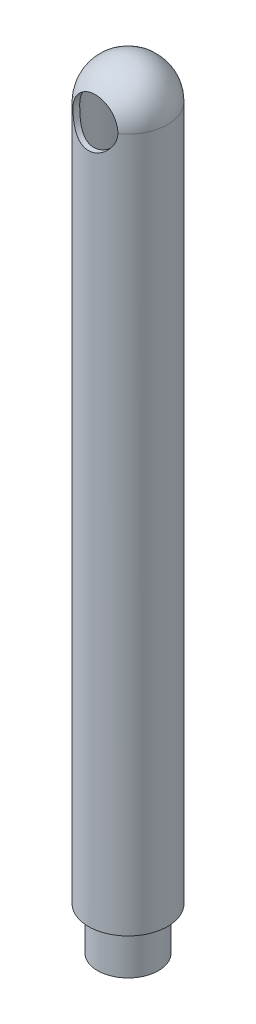
ISO-10303-21;
HEADER;
FILE_DESCRIPTION(('STEP AP214'),'2;1');
FILE_NAME('part.step','',(''),(''),'','','');
FILE_SCHEMA(('AUTOMOTIVE_DESIGN { 1 0 10303 214 1 1 1 1 }'));
ENDSEC;
DATA;
#1=APPLICATION_CONTEXT('core data for automotive mechanical design processes');
#2=APPLICATION_PROTOCOL_DEFINITION('international standard','automotive_design',2000,#1);
#3=PRODUCT_CONTEXT('',#1,'mechanical');
#4=PRODUCT('Part','Part','',(#3));
#5=PRODUCT_RELATED_PRODUCT_CATEGORY('part','',(#4));
#6=PRODUCT_DEFINITION_FORMATION('','',#4);
#7=PRODUCT_DEFINITION_CONTEXT('part definition',#1,'design');
#8=PRODUCT_DEFINITION('design','',#6,#7);
#9=PRODUCT_DEFINITION_SHAPE('','',#8);
#10=(LENGTH_UNIT() NAMED_UNIT(*) SI_UNIT(.MILLI.,.METRE.));
#11=(NAMED_UNIT(*) PLANE_ANGLE_UNIT() SI_UNIT($,.RADIAN.));
#12=(NAMED_UNIT(*) SI_UNIT($,.STERADIAN.) SOLID_ANGLE_UNIT());
#13=UNCERTAINTY_MEASURE_WITH_UNIT(LENGTH_MEASURE(1.E-05),#10,'distance_accuracy_value','');
#14=(GEOMETRIC_REPRESENTATION_CONTEXT(3) GLOBAL_UNCERTAINTY_ASSIGNED_CONTEXT((#13)) GLOBAL_UNIT_ASSIGNED_CONTEXT((#10,
#11,#12)) REPRESENTATION_CONTEXT('',''));
#15=CARTESIAN_POINT('',(0.,0.,0.));
#16=DIRECTION('',(0.,0.,1.));
#17=DIRECTION('',(1.,0.,0.));
#18=AXIS2_PLACEMENT_3D('',#15,#16,#17);
#19=CARTESIAN_POINT('',(0.,0.,0.));
#20=DIRECTION('',(0.,-1.,0.));
#21=DIRECTION('',(0.,0.,-1.));
#22=AXIS2_PLACEMENT_3D('',#19,#20,#21);
#23=CYLINDRICAL_SURFACE('',#22,37.);
#24=CARTESIAN_POINT('',(21.,689.,-30.4630924234556));
#25=CARTESIAN_POINT('',(21.0000073262817,688.731189787036,-30.4630792801586));
#26=CARTESIAN_POINT('',(20.9948387992314,688.462385228528,-30.4666501375205));
#27=CARTESIAN_POINT('',(20.9742055145974,687.925374282696,-30.4808626862339));
#28=CARTESIAN_POINT('',(20.9587413689901,687.657167860769,-30.4915039573165));
#29=CARTESIAN_POINT('',(20.9175892458381,687.122128137417,-30.5197485645538));
#30=CARTESIAN_POINT('',(20.891909689798,686.855293887867,-30.5373461658891));
#31=CARTESIAN_POINT('',(20.8304403165183,686.323346350503,-30.5793087651143));
#32=CARTESIAN_POINT('',(20.7946504035362,686.058233079011,-30.6036738270903));
#33=CARTESIAN_POINT('',(20.6728984187858,685.270076191436,-30.6861697671083));
#34=CARTESIAN_POINT('',(20.57224222865,684.750206175432,-30.753919548947));
#35=CARTESIAN_POINT('',(20.3330008256143,683.722932287711,-30.9126118163972));
#36=CARTESIAN_POINT('',(20.194409237282,683.215530527046,-31.00355820026));
#37=CARTESIAN_POINT('',(19.8814897424874,682.217754555845,-31.2051415253092));
#38=CARTESIAN_POINT('',(19.7072764882901,681.727331476066,-31.3157151471102));
#39=CARTESIAN_POINT('',(19.3246080672965,680.764219599621,-31.5532914305636));
#40=CARTESIAN_POINT('',(19.1161537036553,680.291530387311,-31.6802937068529));
#41=CARTESIAN_POINT('',(18.6662684755912,679.364844691443,-31.9474406108234));
#42=CARTESIAN_POINT('',(18.4247763649775,678.910885012706,-32.0876094921856));
#43=CARTESIAN_POINT('',(17.9106649403664,678.024079854279,-32.3773864757737));
#44=CARTESIAN_POINT('',(17.6380423976134,677.591236571377,-32.5269955563877));
#45=CARTESIAN_POINT('',(17.0322001145425,676.702703312134,-32.8486535677944));
#46=CARTESIAN_POINT('',(16.6956168924399,676.249551600986,-33.0213869364217));
#47=CARTESIAN_POINT('',(15.9877358756512,675.372456590684,-33.3698658898318));
#48=CARTESIAN_POINT('',(15.6164362296818,674.948514851274,-33.5456116348435));
#49=CARTESIAN_POINT('',(14.8406016882713,674.13144294136,-33.8959841445135));
#50=CARTESIAN_POINT('',(14.4360571207653,673.738321803069,-34.0706105674806));
#51=CARTESIAN_POINT('',(13.5954028480296,672.98489364322,-34.4146962655983));
#52=CARTESIAN_POINT('',(13.1592917932624,672.624588026088,-34.5841553193917));
#53=CARTESIAN_POINT('',(12.2149662427592,671.906772510843,-34.9295054327883));
#54=CARTESIAN_POINT('',(11.7038230929027,671.552677050078,-35.1045152955826));
#55=CARTESIAN_POINT('',(10.648364538898,670.8892056197,-35.4389444159262));
#56=CARTESIAN_POINT('',(10.1040465162941,670.579833186542,-35.5983624402359));
#57=CARTESIAN_POINT('',(8.98579377545322,670.009232611914,-35.8969380893811));
#58=CARTESIAN_POINT('',(8.41187673544051,669.747976149483,-36.0361076222407));
#59=CARTESIAN_POINT('',(7.23818631111368,669.276704394683,-36.2900669392295));
#60=CARTESIAN_POINT('',(6.63841665456115,669.066681743658,-36.4048602241857));
#61=CARTESIAN_POINT('',(5.47135075111766,668.716945617311,-36.5975811223989));
#62=CARTESIAN_POINT('',(4.90580182372341,668.572689577531,-36.6778548446089));
#63=CARTESIAN_POINT('',(3.76169678725683,668.331392524959,-36.8127871980505));
#64=CARTESIAN_POINT('',(3.18314137290291,668.234348996632,-36.8674471940032));
#65=CARTESIAN_POINT('',(2.01841377857141,668.088992978192,-36.9495144350707));
#66=CARTESIAN_POINT('',(1.43224700389427,668.040647636648,-36.9769400521156));
#67=CARTESIAN_POINT('',(0.257303114232656,667.993349213026,-37.0037697337288));
#68=CARTESIAN_POINT('',(-0.331473770466264,667.994391856963,-37.0031762230435));
#69=CARTESIAN_POINT('',(-1.4406118576899,668.042958368936,-36.9756312419025));
#70=CARTESIAN_POINT('',(-1.96128382139072,668.085288278257,-36.9516251211814));
#71=CARTESIAN_POINT('',(-2.99657110881471,668.208361192122,-36.8821048028966));
#72=CARTESIAN_POINT('',(-3.51118698314664,668.289100676451,-36.8365925763571));
#73=CARTESIAN_POINT('',(-4.53086126258373,668.488023877406,-36.7251193400592));
#74=CARTESIAN_POINT('',(-5.03591945263188,668.606208435524,-36.6591578707523));
#75=CARTESIAN_POINT('',(-6.03328875863963,668.878700183883,-36.5082708771462));
#76=CARTESIAN_POINT('',(-6.52559936712538,669.033008809755,-36.4233445991601));
#77=CARTESIAN_POINT('',(-7.49908773107969,669.377748025534,-36.2355032633964));
#78=CARTESIAN_POINT('',(-7.98012218348479,669.568496575861,-36.1324305390903));
#79=CARTESIAN_POINT('',(-8.92386468263603,669.98341858198,-35.9109954485033));
#80=CARTESIAN_POINT('',(-9.38657284119493,670.207591833801,-35.7926331755261));
#81=CARTESIAN_POINT('',(-10.2916859365514,670.687608860885,-35.542954937893));
#82=CARTESIAN_POINT('',(-10.7340875849369,670.943457741032,-35.4116368859617));
#83=CARTESIAN_POINT('',(-11.5968272743116,671.48506152568,-35.1385597229849));
#84=CARTESIAN_POINT('',(-12.0171631762837,671.770819321493,-34.9967996028916));
#85=CARTESIAN_POINT('',(-12.8800999131459,672.404197106812,-34.6891289968841));
#86=CARTESIAN_POINT('',(-13.3199190624549,672.75516103625,-34.5222921909058));
#87=CARTESIAN_POINT('',(-14.1687439274886,673.489943167464,-34.1826814793623));
#88=CARTESIAN_POINT('',(-14.5777475745786,673.873763571196,-34.0099071763464));
#89=CARTESIAN_POINT('',(-15.3638750751635,674.672896489012,-33.6620902331708));
#90=CARTESIAN_POINT('',(-15.7409568816733,675.088249212754,-33.4870449410201));
#91=CARTESIAN_POINT('',(-16.4610901684503,675.948290961332,-33.1389872520046));
#92=CARTESIAN_POINT('',(-16.8041404078301,676.392981054908,-32.9659749294703));
#93=CARTESIAN_POINT('',(-17.4865452454602,677.355175145803,-32.6095553743422));
#94=CARTESIAN_POINT('',(-17.8222207618946,677.875539564525,-32.4267984344191));
#95=CARTESIAN_POINT('',(-18.4480855648418,678.947471061146,-32.0748672727313));
#96=CARTESIAN_POINT('',(-18.738267953177,679.499042853835,-31.9056951127363));
#97=CARTESIAN_POINT('',(-19.2695439844222,680.629017273637,-31.5876606985385));
#98=CARTESIAN_POINT('',(-19.5107722206612,681.207340815677,-31.4387431395766));
#99=CARTESIAN_POINT('',(-19.9420266180381,682.388608918111,-31.1669807495764));
#100=CARTESIAN_POINT('',(-20.1320732349065,682.991543530929,-31.0441255064065));
#101=CARTESIAN_POINT('',(-20.4105276151239,684.03888707221,-30.8614542643029));
#102=CARTESIAN_POINT('',(-20.5124191216094,684.478373609711,-30.7936971856278));
#103=CARTESIAN_POINT('',(-20.68797974885,685.36520971563,-30.6760281519441));
#104=CARTESIAN_POINT('',(-20.7616572270046,685.812556914481,-30.6261109128123));
#105=CARTESIAN_POINT('',(-20.8802981419357,686.71500696322,-30.5453493737808));
#106=CARTESIAN_POINT('',(-20.9251225969,687.170136669308,-30.5145974131522));
#107=CARTESIAN_POINT('',(-20.9700148561181,687.855039339858,-30.4837458401841));
#108=CARTESIAN_POINT('',(-20.9812548926054,688.083805043495,-30.4760080073256));
#109=CARTESIAN_POINT('',(-20.9962483577068,688.541705643966,-30.4656790457651));
#110=CARTESIAN_POINT('',(-21.0000015200158,688.770840553642,-30.4630881001358));
#111=CARTESIAN_POINT('',(-21.,689.,-30.4630924234556));
#112=B_SPLINE_CURVE_WITH_KNOTS('',3,(#24,#25,#26,#27,#28,#29,#30,#31,#32,#33,#34,#35,#36,#37,
#38,#39,#40,#41,#42,#43,#44,#45,#46,#47,#48,#49,#50,#51,#52,#53,#54,#55,#56,#57,#58,#59,#60,#61,
#62,#63,#64,#65,#66,#67,#68,#69,#70,#71,#72,#73,#74,#75,#76,#77,#78,#79,#80,#81,#82,#83,#84,#85,
#86,#87,#88,#89,#90,#91,#92,#93,#94,#95,#96,#97,#98,#99,#100,#101,#102,#103,#104,#105,#106,#107,
#108,#109,#110,#111),.UNSPECIFIED.,.F.,.F.,(4,2,2,2,2,2,2,2,2,2,2,2,2,2,2,2,2,2,2,2,2,2,2,2,2,2,
2,2,2,2,2,2,2,2,2,2,2,2,2,2,2,2,2,4),(0.,0.806347326984795,1.61264672857906,2.41828279619611,
3.22392649323257,4.82317636415643,6.42269517060278,8.01714457517711,9.61155658588833,
11.208965453795,12.8065401509339,14.5756774360222,16.344909115749,18.1146573591833,
19.8844813080262,21.8198633708128,23.75539838946,25.6897904895691,27.6239045912399,
29.3888702881486,31.1537419354882,32.9174222147472,34.6809498672029,36.2479068613802,
37.8147202725471,39.3815688966907,40.9484798005701,42.5297450477563,44.1110006458083,
45.6925114135556,47.274175208318,49.033043957547,50.7920306740509,52.5532993763999,
54.3146322760144,56.2491275598297,58.1839158903697,60.113310459884,62.0419327610578,
63.4093634765837,64.7763888256381,66.1499506600343,66.837310691859,67.5246951723651),.UNSPECIFIED.);
#113=CARTESIAN_POINT('',(21.,689.,-30.4630924234556));
#114=VERTEX_POINT('',#113);
#115=CARTESIAN_POINT('',(-21.,689.,-30.4630924234556));
#116=VERTEX_POINT('',#115);
#117=EDGE_CURVE('E55',#114,#116,#112,.T.);
#118=ORIENTED_EDGE('',*,*,#117,.F.);
#119=CARTESIAN_POINT('',(0.,689.,0.));
#120=DIRECTION('',(0.,-1.,0.));
#121=DIRECTION('',(0.,0.,-1.));
#122=AXIS2_PLACEMENT_3D('',#119,#120,#121);
#123=CIRCLE('',#122,37.);
#124=CARTESIAN_POINT('',(21.,689.,30.4630924234556));
#125=VERTEX_POINT('',#124);
#126=EDGE_CURVE('E88',#114,#125,#123,.T.);
#127=ORIENTED_EDGE('',*,*,#126,.T.);
#128=CARTESIAN_POINT('',(-21.,689.,30.4630924234556));
#129=CARTESIAN_POINT('',(-21.0000073262817,688.731189787036,30.4630792801586));
#130=CARTESIAN_POINT('',(-20.9948387992314,688.462385228528,30.4666501375205));
#131=CARTESIAN_POINT('',(-20.9742055145974,687.925374282696,30.4808626862339));
#132=CARTESIAN_POINT('',(-20.9587413689901,687.657167860769,30.4915039573165));
#133=CARTESIAN_POINT('',(-20.9175892458381,687.122128137417,30.5197485645538));
#134=CARTESIAN_POINT('',(-20.891909689798,686.855293887867,30.5373461658891));
#135=CARTESIAN_POINT('',(-20.8304403165183,686.323346350503,30.5793087651143));
#136=CARTESIAN_POINT('',(-20.7946504035362,686.058233079011,30.6036738270903));
#137=CARTESIAN_POINT('',(-20.6728984187858,685.270076191436,30.6861697671083));
#138=CARTESIAN_POINT('',(-20.57224222865,684.750206175432,30.753919548947));
#139=CARTESIAN_POINT('',(-20.3330008256143,683.722932287711,30.9126118163972));
#140=CARTESIAN_POINT('',(-20.194409237282,683.215530527046,31.00355820026));
#141=CARTESIAN_POINT('',(-19.8814897424874,682.217754555845,31.2051415253092));
#142=CARTESIAN_POINT('',(-19.7072764882901,681.727331476066,31.3157151471102));
#143=CARTESIAN_POINT('',(-19.3246080672965,680.764219599621,31.5532914305636));
#144=CARTESIAN_POINT('',(-19.1161537036553,680.291530387311,31.6802937068529));
#145=CARTESIAN_POINT('',(-18.6662684755912,679.364844691443,31.9474406108234));
#146=CARTESIAN_POINT('',(-18.4247763649775,678.910885012706,32.0876094921856));
#147=CARTESIAN_POINT('',(-17.9106649403664,678.024079854279,32.3773864757737));
#148=CARTESIAN_POINT('',(-17.6380423976134,677.591236571377,32.5269955563877));
#149=CARTESIAN_POINT('',(-17.0322001145425,676.702703312134,32.8486535677944));
#150=CARTESIAN_POINT('',(-16.6956168924399,676.249551600986,33.0213869364217));
#151=CARTESIAN_POINT('',(-15.9877358756512,675.372456590684,33.3698658898318));
#152=CARTESIAN_POINT('',(-15.6164362296818,674.948514851274,33.5456116348435));
#153=CARTESIAN_POINT('',(-14.8406016882713,674.13144294136,33.8959841445135));
#154=CARTESIAN_POINT('',(-14.4360571207653,673.738321803069,34.0706105674806));
#155=CARTESIAN_POINT('',(-13.5954028480296,672.98489364322,34.4146962655983));
#156=CARTESIAN_POINT('',(-13.1592917932624,672.624588026088,34.5841553193917));
#157=CARTESIAN_POINT('',(-12.2149662427592,671.906772510843,34.9295054327883));
#158=CARTESIAN_POINT('',(-11.7038230929027,671.552677050078,35.1045152955826));
#159=CARTESIAN_POINT('',(-10.648364538898,670.8892056197,35.4389444159262));
#160=CARTESIAN_POINT('',(-10.1040465162941,670.579833186542,35.5983624402359));
#161=CARTESIAN_POINT('',(-8.98579377545322,670.009232611914,35.8969380893811));
#162=CARTESIAN_POINT('',(-8.41187673544051,669.747976149483,36.0361076222407));
#163=CARTESIAN_POINT('',(-7.23818631111368,669.276704394683,36.2900669392295));
#164=CARTESIAN_POINT('',(-6.63841665456115,669.066681743658,36.4048602241857));
#165=CARTESIAN_POINT('',(-5.47135075111766,668.716945617311,36.5975811223989));
#166=CARTESIAN_POINT('',(-4.90580182372341,668.572689577531,36.6778548446089));
#167=CARTESIAN_POINT('',(-3.76169678725683,668.331392524959,36.8127871980505));
#168=CARTESIAN_POINT('',(-3.18314137290291,668.234348996632,36.8674471940032));
#169=CARTESIAN_POINT('',(-2.01841377857141,668.088992978192,36.9495144350707));
#170=CARTESIAN_POINT('',(-1.43224700389427,668.040647636648,36.9769400521156));
#171=CARTESIAN_POINT('',(-0.257303114232656,667.993349213026,37.0037697337288));
#172=CARTESIAN_POINT('',(0.331473770466264,667.994391856963,37.0031762230435));
#173=CARTESIAN_POINT('',(1.4406118576899,668.042958368936,36.9756312419025));
#174=CARTESIAN_POINT('',(1.96128382139072,668.085288278257,36.9516251211814));
#175=CARTESIAN_POINT('',(2.99657110881471,668.208361192122,36.8821048028966));
#176=CARTESIAN_POINT('',(3.51118698314664,668.289100676451,36.8365925763571));
#177=CARTESIAN_POINT('',(4.53086126258373,668.488023877406,36.7251193400592));
#178=CARTESIAN_POINT('',(5.03591945263188,668.606208435524,36.6591578707523));
#179=CARTESIAN_POINT('',(6.03328875863963,668.878700183883,36.5082708771462));
#180=CARTESIAN_POINT('',(6.52559936712538,669.033008809755,36.4233445991601));
#181=CARTESIAN_POINT('',(7.49908773107969,669.377748025534,36.2355032633964));
#182=CARTESIAN_POINT('',(7.98012218348479,669.568496575861,36.1324305390903));
#183=CARTESIAN_POINT('',(8.92386468263603,669.98341858198,35.9109954485033));
#184=CARTESIAN_POINT('',(9.38657284119493,670.207591833801,35.7926331755261));
#185=CARTESIAN_POINT('',(10.2916859365514,670.687608860885,35.542954937893));
#186=CARTESIAN_POINT('',(10.7340875849369,670.943457741032,35.4116368859617));
#187=CARTESIAN_POINT('',(11.5968272743116,671.48506152568,35.1385597229849));
#188=CARTESIAN_POINT('',(12.0171631762837,671.770819321493,34.9967996028916));
#189=CARTESIAN_POINT('',(12.8800999131459,672.404197106812,34.6891289968841));
#190=CARTESIAN_POINT('',(13.3199190624549,672.75516103625,34.5222921909058));
#191=CARTESIAN_POINT('',(14.1687439274886,673.489943167464,34.1826814793623));
#192=CARTESIAN_POINT('',(14.5777475745786,673.873763571196,34.0099071763464));
#193=CARTESIAN_POINT('',(15.3638750751635,674.672896489012,33.6620902331708));
#194=CARTESIAN_POINT('',(15.7409568816733,675.088249212754,33.4870449410201));
#195=CARTESIAN_POINT('',(16.4610901684503,675.948290961332,33.1389872520046));
#196=CARTESIAN_POINT('',(16.8041404078301,676.392981054908,32.9659749294703));
#197=CARTESIAN_POINT('',(17.4865452454602,677.355175145803,32.6095553743422));
#198=CARTESIAN_POINT('',(17.8222207618946,677.875539564525,32.4267984344191));
#199=CARTESIAN_POINT('',(18.4480855648418,678.947471061146,32.0748672727313));
#200=CARTESIAN_POINT('',(18.738267953177,679.499042853835,31.9056951127363));
#201=CARTESIAN_POINT('',(19.2695439844222,680.629017273637,31.5876606985385));
#202=CARTESIAN_POINT('',(19.5107722206612,681.207340815677,31.4387431395766));
#203=CARTESIAN_POINT('',(19.9420266180381,682.388608918111,31.1669807495764));
#204=CARTESIAN_POINT('',(20.1320732349065,682.991543530929,31.0441255064065));
#205=CARTESIAN_POINT('',(20.4105276151239,684.03888707221,30.8614542643029));
#206=CARTESIAN_POINT('',(20.5124191216094,684.478373609711,30.7936971856278));
#207=CARTESIAN_POINT('',(20.68797974885,685.36520971563,30.6760281519441));
#208=CARTESIAN_POINT('',(20.7616572270046,685.812556914481,30.6261109128123));
#209=CARTESIAN_POINT('',(20.8802981419357,686.71500696322,30.5453493737808));
#210=CARTESIAN_POINT('',(20.9251225969,687.170136669308,30.5145974131522));
#211=CARTESIAN_POINT('',(20.9700148561181,687.855039339858,30.4837458401841));
#212=CARTESIAN_POINT('',(20.9812548926054,688.083805043495,30.4760080073256));
#213=CARTESIAN_POINT('',(20.9962483577068,688.541705643966,30.4656790457651));
#214=CARTESIAN_POINT('',(21.0000015200158,688.770840553642,30.4630881001358));
#215=CARTESIAN_POINT('',(21.,689.,30.4630924234556));
#216=B_SPLINE_CURVE_WITH_KNOTS('',3,(#128,#129,#130,#131,#132,#133,#134,#135,#136,#137,#138,
#139,#140,#141,#142,#143,#144,#145,#146,#147,#148,#149,#150,#151,#152,#153,#154,#155,#156,#157,
#158,#159,#160,#161,#162,#163,#164,#165,#166,#167,#168,#169,#170,#171,#172,#173,#174,#175,#176,
#177,#178,#179,#180,#181,#182,#183,#184,#185,#186,#187,#188,#189,#190,#191,#192,#193,#194,#195,
#196,#197,#198,#199,#200,#201,#202,#203,#204,#205,#206,#207,#208,#209,#210,#211,#212,#213,#214,
#215),.UNSPECIFIED.,.F.,.F.,(4,2,2,2,2,2,2,2,2,2,2,2,2,2,2,2,2,2,2,2,2,2,2,2,2,2,2,2,2,2,2,2,2,
2,2,2,2,2,2,2,2,2,2,4),(0.,0.806347326984795,1.61264672857906,2.41828279619611,3.22392649323257,
4.82317636415643,6.42269517060278,8.01714457517711,9.61155658588833,11.208965453795,
12.8065401509339,14.5756774360222,16.344909115749,18.1146573591833,19.8844813080262,
21.8198633708128,23.75539838946,25.6897904895691,27.6239045912399,29.3888702881486,
31.1537419354882,32.9174222147472,34.6809498672029,36.2479068613802,37.8147202725471,
39.3815688966907,40.9484798005701,42.5297450477563,44.1110006458083,45.6925114135556,
47.274175208318,49.033043957547,50.7920306740509,52.5532993763999,54.3146322760144,
56.2491275598297,58.1839158903697,60.113310459884,62.0419327610578,63.4093634765837,
64.7763888256381,66.1499506600343,66.837310691859,67.5246951723651),.UNSPECIFIED.);
#217=CARTESIAN_POINT('',(-21.,689.,30.4630924234556));
#218=VERTEX_POINT('',#217);
#219=EDGE_CURVE('E62',#218,#125,#216,.T.);
#220=ORIENTED_EDGE('',*,*,#219,.F.);
#221=EDGE_CURVE('E101',#218,#116,#123,.T.);
#222=ORIENTED_EDGE('',*,*,#221,.T.);
#223=EDGE_LOOP('',(#118,#127,#220,#222));
#224=FACE_BOUND('',#223,.T.);
#225=CARTESIAN_POINT('',(0.,40.,0.));
#226=DIRECTION('',(0.,-1.,0.));
#227=DIRECTION('',(0.,0.,-1.));
#228=AXIS2_PLACEMENT_3D('',#225,#226,#227);
#229=CIRCLE('',#228,37.);
#230=CARTESIAN_POINT('',(0.,40.,-37.));
#231=VERTEX_POINT('',#230);
#232=EDGE_CURVE('E137',#231,#231,#229,.T.);
#233=ORIENTED_EDGE('',*,*,#232,.F.);
#234=EDGE_LOOP('',(#233));
#235=FACE_BOUND('',#234,.T.);
#236=ADVANCED_FACE('F36',(#224,#235),#23,.T.);
#237=CARTESIAN_POINT('',(0.,689.,0.));
#238=DIRECTION('',(0.,-1.,0.));
#239=DIRECTION('',(1.,0.,0.));
#240=AXIS2_PLACEMENT_3D('',#237,#238,#239);
#241=SPHERICAL_SURFACE('',#240,37.);
#242=CARTESIAN_POINT('',(0.,689.,30.4630924234556));
#243=DIRECTION('',(0.,0.,-1.));
#244=DIRECTION('',(-1.,0.,0.));
#245=AXIS2_PLACEMENT_3D('',#242,#243,#244);
#246=CIRCLE('',#245,21.);
#247=EDGE_CURVE('E130',#125,#218,#246,.F.);
#248=ORIENTED_EDGE('',*,*,#247,.F.);
#249=ORIENTED_EDGE('',*,*,#126,.F.);
#250=CARTESIAN_POINT('',(0.,689.,-30.4630924234556));
#251=DIRECTION('',(0.,0.,1.));
#252=DIRECTION('',(1.,0.,0.));
#253=AXIS2_PLACEMENT_3D('',#250,#251,#252);
#254=CIRCLE('',#253,21.);
#255=EDGE_CURVE('E131',#116,#114,#254,.F.);
#256=ORIENTED_EDGE('',*,*,#255,.F.);
#257=ORIENTED_EDGE('',*,*,#221,.F.);
#258=EDGE_LOOP('',(#248,#249,#256,#257));
#259=FACE_BOUND('',#258,.T.);
#260=ADVANCED_FACE('F173',(#259),#241,.T.);
#261=CARTESIAN_POINT('',(0.,689.,0.));
#262=DIRECTION('',(0.,-1.,0.));
#263=DIRECTION('',(1.,0.,0.));
#264=AXIS2_PLACEMENT_3D('',#261,#262,#263);
#265=SPHERICAL_SURFACE('',#264,32.);
#266=CARTESIAN_POINT('',(0.,689.,0.));
#267=DIRECTION('',(0.,-1.,0.));
#268=DIRECTION('',(0.,0.,-1.));
#269=AXIS2_PLACEMENT_3D('',#266,#267,#268);
#270=CIRCLE('',#269,32.);
#271=CARTESIAN_POINT('',(21.,689.,-24.1453929352993));
#272=VERTEX_POINT('',#271);
#273=CARTESIAN_POINT('',(21.,689.,24.1453929352993));
#274=VERTEX_POINT('',#273);
#275=EDGE_CURVE('E94',#272,#274,#270,.T.);
#276=ORIENTED_EDGE('',*,*,#275,.T.);
#277=CARTESIAN_POINT('',(0.,689.,24.1453929352993));
#278=DIRECTION('',(0.,0.,-1.));
#279=DIRECTION('',(-1.,0.,0.));
#280=AXIS2_PLACEMENT_3D('',#277,#278,#279);
#281=CIRCLE('',#280,21.);
#282=CARTESIAN_POINT('',(-21.,689.,24.1453929352993));
#283=VERTEX_POINT('',#282);
#284=EDGE_CURVE('E83',#274,#283,#281,.F.);
#285=ORIENTED_EDGE('',*,*,#284,.T.);
#286=CARTESIAN_POINT('',(-21.,689.,-24.1453929352993));
#287=VERTEX_POINT('',#286);
#288=EDGE_CURVE('E93',#283,#287,#270,.T.);
#289=ORIENTED_EDGE('',*,*,#288,.T.);
#290=CARTESIAN_POINT('',(0.,689.,-24.1453929352993));
#291=DIRECTION('',(0.,0.,1.));
#292=DIRECTION('',(1.,0.,0.));
#293=AXIS2_PLACEMENT_3D('',#290,#291,#292);
#294=CIRCLE('',#293,21.);
#295=EDGE_CURVE('E95',#287,#272,#294,.F.);
#296=ORIENTED_EDGE('',*,*,#295,.T.);
#297=EDGE_LOOP('',(#276,#285,#289,#296));
#298=FACE_BOUND('',#297,.T.);
#299=ADVANCED_FACE('F91',(#298),#265,.F.);
#300=CARTESIAN_POINT('',(0.,0.,0.));
#301=DIRECTION('',(0.,-1.,0.));
#302=DIRECTION('',(0.,0.,-1.));
#303=AXIS2_PLACEMENT_3D('',#300,#301,#302);
#304=CYLINDRICAL_SURFACE('',#303,32.);
#305=ORIENTED_EDGE('',*,*,#275,.F.);
#306=CARTESIAN_POINT('',(21.,689.,-24.1453929352993));
#307=CARTESIAN_POINT('',(21.0000088316979,688.740691037745,-24.1453747677393));
#308=CARTESIAN_POINT('',(20.9951972765071,688.481389489406,-24.1495697541191));
#309=CARTESIAN_POINT('',(20.9760002226579,687.963431901864,-24.1662514695807));
#310=CARTESIAN_POINT('',(20.9616156272982,687.704775804069,-24.1787374163389));
#311=CARTESIAN_POINT('',(20.9233631858055,687.189012695057,-24.2118458608544));
#312=CARTESIAN_POINT('',(20.8995071977962,686.931904153378,-24.2324581842149));
#313=CARTESIAN_POINT('',(20.8424448952335,686.41950084767,-24.2815545901595));
#314=CARTESIAN_POINT('',(20.8092384326426,686.164206112423,-24.3100387973717));
#315=CARTESIAN_POINT('',(20.6965472767031,685.406718763127,-24.4062037181729));
#316=CARTESIAN_POINT('',(20.603607348189,684.907831391839,-24.484935518309));
#317=CARTESIAN_POINT('',(20.383230871151,683.922703361117,-24.6686919441093));
#318=CARTESIAN_POINT('',(20.255784861515,683.436466210343,-24.7737237803018));
#319=CARTESIAN_POINT('',(19.9689375471104,682.481658382307,-25.0055059082618));
#320=CARTESIAN_POINT('',(19.8096982360572,682.013011902403,-25.1321456458305));
#321=CARTESIAN_POINT('',(19.4606530644217,681.092710379754,-25.4033815484109));
#322=CARTESIAN_POINT('',(19.2708486384692,680.641054540749,-25.5479768705714));
#323=CARTESIAN_POINT('',(18.8617380553961,679.754802944317,-25.8514962040515));
#324=CARTESIAN_POINT('',(18.6423570553214,679.320254202795,-26.0104562170485));
#325=CARTESIAN_POINT('',(18.1758299736148,678.470314733637,-26.3385753299218));
#326=CARTESIAN_POINT('',(17.9286803038417,678.054926491637,-26.5077357465364));
#327=CARTESIAN_POINT('',(17.3689891030261,677.183709731309,-26.8783737219659));
#328=CARTESIAN_POINT('',(17.052189822581,676.731064150408,-27.080913932151));
#329=CARTESIAN_POINT('',(16.3848883436248,675.853157212833,-27.4897906969876));
#330=CARTESIAN_POINT('',(16.0343839514128,675.427897641593,-27.6961274980328));
#331=CARTESIAN_POINT('',(15.3007230709074,674.605853630457,-28.1080933809534));
#332=CARTESIAN_POINT('',(14.9175553028035,674.209079115301,-28.3137221926224));
#333=CARTESIAN_POINT('',(14.1197500789186,673.445659373694,-28.7199073269651));
#334=CARTESIAN_POINT('',(13.705110563228,673.079016122691,-28.9204633164618));
#335=CARTESIAN_POINT('',(12.7858306114702,672.329022586695,-29.3395942097164));
#336=CARTESIAN_POINT('',(12.2766837938949,671.950408540102,-29.5568100432697));
#337=CARTESIAN_POINT('',(11.2210442373302,671.237858130975,-29.9734912945481));
#338=CARTESIAN_POINT('',(10.6745471763521,670.903926952195,-30.1729546518738));
#339=CARTESIAN_POINT('',(9.54741372521584,670.284766391966,-30.5483126085786));
#340=CARTESIAN_POINT('',(8.96680261086228,669.999501549402,-30.7242243487406));
#341=CARTESIAN_POINT('',(7.77493832830597,669.481488722636,-31.0472424497318));
#342=CARTESIAN_POINT('',(7.16369149881971,669.248729928985,-31.1943547386924));
#343=CARTESIAN_POINT('',(5.98400123885732,668.862132043321,-31.4406436445465));
#344=CARTESIAN_POINT('',(5.41820120544409,668.702441660689,-31.5433055403064));
#345=CARTESIAN_POINT('',(4.27079361705989,668.430415310377,-31.7190322235755));
#346=CARTESIAN_POINT('',(3.68918710819912,668.31807621696,-31.7920989646969));
#347=CARTESIAN_POINT('',(2.51606531754386,668.142847689961,-31.9063691696717));
#348=CARTESIAN_POINT('',(1.9245606122787,668.079908536209,-31.9476046704178));
#349=CARTESIAN_POINT('',(0.7369953107896,668.004508202843,-31.9970285689199));
#350=CARTESIAN_POINT('',(0.140935336372722,667.992040252855,-32.0052213991287));
#351=CARTESIAN_POINT('',(-0.961567175425774,668.01588625848,-31.9895769030265));
#352=CARTESIAN_POINT('',(-1.46824295696804,668.045267102885,-31.9702917121716));
#353=CARTESIAN_POINT('',(-2.47664429448446,668.140406828278,-31.9080134046263));
#354=CARTESIAN_POINT('',(-2.97837046012765,668.206161170547,-31.8650232458663));
#355=CARTESIAN_POINT('',(-3.97337860741307,668.373153357857,-31.756303248893));
#356=CARTESIAN_POINT('',(-4.46666012877827,668.474393130621,-31.6905721752968));
#357=CARTESIAN_POINT('',(-5.44157414604316,668.711064196975,-31.5377987791912));
#358=CARTESIAN_POINT('',(-5.92320613966882,668.84649696194,-31.4507555395927));
#359=CARTESIAN_POINT('',(-6.87094197136686,669.149631034804,-31.257376111375));
#360=CARTESIAN_POINT('',(-7.33707852742385,669.317258516305,-31.1510840937894));
#361=CARTESIAN_POINT('',(-8.25265227363693,669.683250544071,-30.9211342776345));
#362=CARTESIAN_POINT('',(-8.70208973558278,669.881614589803,-30.7974767618578));
#363=CARTESIAN_POINT('',(-9.58238329813765,670.307301771889,-30.5350435362887));
#364=CARTESIAN_POINT('',(-10.013240417395,670.534623317969,-30.3962686567649));
#365=CARTESIAN_POINT('',(-10.8549575374055,671.016531513341,-30.1059487747669));
#366=CARTESIAN_POINT('',(-11.2658152203511,671.271121311959,-29.9544022976783));
#367=CARTESIAN_POINT('',(-12.1182215278016,671.840618256934,-29.6206757017217));
#368=CARTESIAN_POINT('',(-12.5568486936885,672.159066537129,-29.4370706534333));
#369=CARTESIAN_POINT('',(-13.405734382334,672.826629289831,-29.0603162969956));
#370=CARTESIAN_POINT('',(-13.815990880721,673.175745946633,-28.8671663094557));
#371=CARTESIAN_POINT('',(-14.6077999759704,673.903579506988,-28.4746867647341));
#372=CARTESIAN_POINT('',(-14.9892960107424,674.282351898377,-28.2753460659012));
#373=CARTESIAN_POINT('',(-15.7217174653375,675.06745349012,-27.874753233038));
#374=CARTESIAN_POINT('',(-16.0726409813813,675.473784403772,-27.6735009808377));
#375=CARTESIAN_POINT('',(-16.7933004623472,676.375949408215,-27.2431023121571));
#376=CARTESIAN_POINT('',(-17.1579263128651,676.876052917794,-27.014313558808));
#377=CARTESIAN_POINT('',(-17.8434627758509,677.909667815585,-26.5664923504611));
#378=CARTESIAN_POINT('',(-18.1643662674574,678.443184625065,-26.3474614885868));
#379=CARTESIAN_POINT('',(-18.7588133044342,679.53985215885,-25.9275689968921));
#380=CARTESIAN_POINT('',(-19.0325378015737,680.102878345072,-25.7266394243189));
#381=CARTESIAN_POINT('',(-19.5310833971079,681.258398140622,-25.350235188121));
#382=CARTESIAN_POINT('',(-19.755915286797,681.850885211971,-25.1747549103287));
#383=CARTESIAN_POINT('',(-20.1230748987986,682.970519282704,-24.881888996788));
#384=CARTESIAN_POINT('',(-20.2727352808586,683.494016151921,-24.7597318742219));
#385=CARTESIAN_POINT('',(-20.5318473985312,684.556811381714,-24.5452986216119));
#386=CARTESIAN_POINT('',(-20.6413188295874,685.096101861999,-24.4530078575638));
#387=CARTESIAN_POINT('',(-20.7742853301892,685.916631418739,-24.3399343722897));
#388=CARTESIAN_POINT('',(-20.8135326807269,686.193678818179,-24.3063534449985));
#389=CARTESIAN_POINT('',(-20.8810059901811,686.750092842199,-24.2484140350027));
#390=CARTESIAN_POINT('',(-20.9092322123994,687.029459411211,-24.2240553319738));
#391=CARTESIAN_POINT('',(-20.954519885941,687.590265390923,-24.1848928121051));
#392=CARTESIAN_POINT('',(-20.9715613336249,687.87170761005,-24.1701061151591));
#393=CARTESIAN_POINT('',(-20.9943083173097,688.43542958441,-24.150342811806));
#394=CARTESIAN_POINT('',(-21.0000123483377,688.717709445855,-24.1453675078022));
#395=CARTESIAN_POINT('',(-21.,689.,-24.1453929352993));
#396=B_SPLINE_CURVE_WITH_KNOTS('',3,(#306,#307,#308,#309,#310,#311,#312,#313,#314,#315,#316,
#317,#318,#319,#320,#321,#322,#323,#324,#325,#326,#327,#328,#329,#330,#331,#332,#333,#334,#335,
#336,#337,#338,#339,#340,#341,#342,#343,#344,#345,#346,#347,#348,#349,#350,#351,#352,#353,#354,
#355,#356,#357,#358,#359,#360,#361,#362,#363,#364,#365,#366,#367,#368,#369,#370,#371,#372,#373,
#374,#375,#376,#377,#378,#379,#380,#381,#382,#383,#384,#385,#386,#387,#388,#389,#390,#391,#392,
#393,#394,#395),.UNSPECIFIED.,.F.,.F.,(4,2,2,2,2,2,2,2,2,2,2,2,2,2,2,2,2,2,2,2,2,2,2,2,2,2,2,2,
2,2,2,2,2,2,2,2,2,2,2,2,2,2,2,2,4),(0.,0.777835610910433,1.55559783675135,2.33238936445954,
3.10919319107672,4.64751016167817,6.18624934637902,7.71733970660544,9.24835822323328,
10.7833263329428,12.3184930128536,14.0821507442628,15.8459233413221,17.6103075177793,
19.374807277617,21.384045952679,23.3935175220247,25.4015185613869,27.4091058345459,
29.196832167098,30.9844404704111,32.7702472619219,34.5558144914494,36.0776528197473,
37.5993012944336,39.1210324444981,40.6428290880737,42.1611768561701,43.6794999012305,
45.1977395996819,46.7161548355704,48.4313200899512,50.1466076028914,51.8651849685514,
53.5838692752517,55.5610746202654,57.5386015997573,59.5083664463177,61.4776960954902,
63.1495324713511,64.8205484313182,65.6657008846277,66.5108331454721,67.3574728112179,
68.2042248557166),.UNSPECIFIED.);
#397=EDGE_CURVE('E11',#272,#287,#396,.T.);
#398=ORIENTED_EDGE('',*,*,#397,.T.);
#399=ORIENTED_EDGE('',*,*,#288,.F.);
#400=CARTESIAN_POINT('',(-21.,689.,24.1453929352993));
#401=CARTESIAN_POINT('',(-21.0000088316979,688.740691037745,24.1453747677393));
#402=CARTESIAN_POINT('',(-20.9951972765071,688.481389489406,24.1495697541191));
#403=CARTESIAN_POINT('',(-20.9760002226579,687.963431901864,24.1662514695807));
#404=CARTESIAN_POINT('',(-20.9616156272982,687.704775804069,24.1787374163389));
#405=CARTESIAN_POINT('',(-20.9233631858055,687.189012695057,24.2118458608544));
#406=CARTESIAN_POINT('',(-20.8995071977962,686.931904153378,24.2324581842149));
#407=CARTESIAN_POINT('',(-20.8424448952335,686.41950084767,24.2815545901595));
#408=CARTESIAN_POINT('',(-20.8092384326426,686.164206112423,24.3100387973717));
#409=CARTESIAN_POINT('',(-20.6965472767031,685.406718763127,24.4062037181729));
#410=CARTESIAN_POINT('',(-20.603607348189,684.907831391839,24.484935518309));
#411=CARTESIAN_POINT('',(-20.383230871151,683.922703361117,24.6686919441093));
#412=CARTESIAN_POINT('',(-20.255784861515,683.436466210343,24.7737237803018));
#413=CARTESIAN_POINT('',(-19.9689375471104,682.481658382307,25.0055059082618));
#414=CARTESIAN_POINT('',(-19.8096982360572,682.013011902403,25.1321456458305));
#415=CARTESIAN_POINT('',(-19.4606530644217,681.092710379754,25.4033815484109));
#416=CARTESIAN_POINT('',(-19.2708486384692,680.641054540749,25.5479768705714));
#417=CARTESIAN_POINT('',(-18.8617380553961,679.754802944317,25.8514962040515));
#418=CARTESIAN_POINT('',(-18.6423570553214,679.320254202795,26.0104562170485));
#419=CARTESIAN_POINT('',(-18.1758299736148,678.470314733637,26.3385753299218));
#420=CARTESIAN_POINT('',(-17.9286803038417,678.054926491637,26.5077357465364));
#421=CARTESIAN_POINT('',(-17.3689891030261,677.183709731309,26.8783737219659));
#422=CARTESIAN_POINT('',(-17.052189822581,676.731064150408,27.080913932151));
#423=CARTESIAN_POINT('',(-16.3848883436248,675.853157212833,27.4897906969876));
#424=CARTESIAN_POINT('',(-16.0343839514128,675.427897641593,27.6961274980328));
#425=CARTESIAN_POINT('',(-15.3007230709074,674.605853630457,28.1080933809534));
#426=CARTESIAN_POINT('',(-14.9175553028035,674.209079115301,28.3137221926224));
#427=CARTESIAN_POINT('',(-14.1197500789186,673.445659373694,28.7199073269651));
#428=CARTESIAN_POINT('',(-13.705110563228,673.079016122691,28.9204633164618));
#429=CARTESIAN_POINT('',(-12.7858306114702,672.329022586695,29.3395942097164));
#430=CARTESIAN_POINT('',(-12.2766837938949,671.950408540102,29.5568100432697));
#431=CARTESIAN_POINT('',(-11.2210442373302,671.237858130975,29.9734912945481));
#432=CARTESIAN_POINT('',(-10.6745471763521,670.903926952195,30.1729546518738));
#433=CARTESIAN_POINT('',(-9.54741372521584,670.284766391966,30.5483126085786));
#434=CARTESIAN_POINT('',(-8.96680261086228,669.999501549402,30.7242243487406));
#435=CARTESIAN_POINT('',(-7.77493832830597,669.481488722636,31.0472424497318));
#436=CARTESIAN_POINT('',(-7.16369149881971,669.248729928985,31.1943547386924));
#437=CARTESIAN_POINT('',(-5.98400123885732,668.862132043321,31.4406436445465));
#438=CARTESIAN_POINT('',(-5.41820120544409,668.702441660689,31.5433055403064));
#439=CARTESIAN_POINT('',(-4.27079361705989,668.430415310377,31.7190322235755));
#440=CARTESIAN_POINT('',(-3.68918710819912,668.31807621696,31.7920989646969));
#441=CARTESIAN_POINT('',(-2.51606531754386,668.142847689961,31.9063691696717));
#442=CARTESIAN_POINT('',(-1.9245606122787,668.079908536209,31.9476046704178));
#443=CARTESIAN_POINT('',(-0.7369953107896,668.004508202843,31.9970285689199));
#444=CARTESIAN_POINT('',(-0.140935336372722,667.992040252855,32.0052213991287));
#445=CARTESIAN_POINT('',(0.961567175425774,668.01588625848,31.9895769030265));
#446=CARTESIAN_POINT('',(1.46824295696804,668.045267102885,31.9702917121716));
#447=CARTESIAN_POINT('',(2.47664429448446,668.140406828278,31.9080134046263));
#448=CARTESIAN_POINT('',(2.97837046012765,668.206161170547,31.8650232458663));
#449=CARTESIAN_POINT('',(3.97337860741307,668.373153357857,31.756303248893));
#450=CARTESIAN_POINT('',(4.46666012877827,668.474393130621,31.6905721752968));
#451=CARTESIAN_POINT('',(5.44157414604316,668.711064196975,31.5377987791912));
#452=CARTESIAN_POINT('',(5.92320613966882,668.84649696194,31.4507555395927));
#453=CARTESIAN_POINT('',(6.87094197136686,669.149631034804,31.257376111375));
#454=CARTESIAN_POINT('',(7.33707852742385,669.317258516305,31.1510840937894));
#455=CARTESIAN_POINT('',(8.25265227363693,669.683250544071,30.9211342776345));
#456=CARTESIAN_POINT('',(8.70208973558278,669.881614589803,30.7974767618578));
#457=CARTESIAN_POINT('',(9.58238329813765,670.307301771889,30.5350435362887));
#458=CARTESIAN_POINT('',(10.013240417395,670.534623317969,30.3962686567649));
#459=CARTESIAN_POINT('',(10.8549575374055,671.016531513341,30.1059487747669));
#460=CARTESIAN_POINT('',(11.2658152203511,671.271121311959,29.9544022976783));
#461=CARTESIAN_POINT('',(12.1182215278016,671.840618256934,29.6206757017217));
#462=CARTESIAN_POINT('',(12.5568486936885,672.159066537129,29.4370706534333));
#463=CARTESIAN_POINT('',(13.405734382334,672.826629289831,29.0603162969956));
#464=CARTESIAN_POINT('',(13.815990880721,673.175745946633,28.8671663094557));
#465=CARTESIAN_POINT('',(14.6077999759704,673.903579506988,28.4746867647341));
#466=CARTESIAN_POINT('',(14.9892960107424,674.282351898377,28.2753460659012));
#467=CARTESIAN_POINT('',(15.7217174653375,675.06745349012,27.874753233038));
#468=CARTESIAN_POINT('',(16.0726409813813,675.473784403772,27.6735009808377));
#469=CARTESIAN_POINT('',(16.7933004623472,676.375949408215,27.2431023121571));
#470=CARTESIAN_POINT('',(17.1579263128651,676.876052917794,27.014313558808));
#471=CARTESIAN_POINT('',(17.8434627758509,677.909667815585,26.5664923504611));
#472=CARTESIAN_POINT('',(18.1643662674574,678.443184625065,26.3474614885868));
#473=CARTESIAN_POINT('',(18.7588133044342,679.53985215885,25.9275689968921));
#474=CARTESIAN_POINT('',(19.0325378015737,680.102878345072,25.7266394243189));
#475=CARTESIAN_POINT('',(19.5310833971079,681.258398140622,25.350235188121));
#476=CARTESIAN_POINT('',(19.755915286797,681.850885211971,25.1747549103287));
#477=CARTESIAN_POINT('',(20.1230748987986,682.970519282704,24.881888996788));
#478=CARTESIAN_POINT('',(20.2727352808586,683.494016151921,24.7597318742219));
#479=CARTESIAN_POINT('',(20.5318473985312,684.556811381714,24.5452986216119));
#480=CARTESIAN_POINT('',(20.6413188295874,685.096101861999,24.4530078575638));
#481=CARTESIAN_POINT('',(20.7742853301892,685.916631418739,24.3399343722897));
#482=CARTESIAN_POINT('',(20.8135326807269,686.193678818179,24.3063534449985));
#483=CARTESIAN_POINT('',(20.8810059901811,686.750092842199,24.2484140350027));
#484=CARTESIAN_POINT('',(20.9092322123994,687.029459411211,24.2240553319738));
#485=CARTESIAN_POINT('',(20.954519885941,687.590265390923,24.1848928121051));
#486=CARTESIAN_POINT('',(20.9715613336249,687.87170761005,24.1701061151591));
#487=CARTESIAN_POINT('',(20.9943083173097,688.43542958441,24.150342811806));
#488=CARTESIAN_POINT('',(21.0000123483377,688.717709445855,24.1453675078022));
#489=CARTESIAN_POINT('',(21.,689.,24.1453929352993));
#490=B_SPLINE_CURVE_WITH_KNOTS('',3,(#400,#401,#402,#403,#404,#405,#406,#407,#408,#409,#410,
#411,#412,#413,#414,#415,#416,#417,#418,#419,#420,#421,#422,#423,#424,#425,#426,#427,#428,#429,
#430,#431,#432,#433,#434,#435,#436,#437,#438,#439,#440,#441,#442,#443,#444,#445,#446,#447,#448,
#449,#450,#451,#452,#453,#454,#455,#456,#457,#458,#459,#460,#461,#462,#463,#464,#465,#466,#467,
#468,#469,#470,#471,#472,#473,#474,#475,#476,#477,#478,#479,#480,#481,#482,#483,#484,#485,#486,
#487,#488,#489),.UNSPECIFIED.,.F.,.F.,(4,2,2,2,2,2,2,2,2,2,2,2,2,2,2,2,2,2,2,2,2,2,2,2,2,2,2,2,
2,2,2,2,2,2,2,2,2,2,2,2,2,2,2,2,4),(0.,0.777835610910433,1.55559783675135,2.33238936445954,
3.10919319107672,4.64751016167817,6.18624934637902,7.71733970660544,9.24835822323328,
10.7833263329428,12.3184930128536,14.0821507442628,15.8459233413221,17.6103075177793,
19.374807277617,21.384045952679,23.3935175220247,25.4015185613869,27.4091058345459,
29.196832167098,30.9844404704111,32.7702472619219,34.5558144914494,36.0776528197473,
37.5993012944336,39.1210324444981,40.6428290880737,42.1611768561701,43.6794999012305,
45.1977395996819,46.7161548355704,48.4313200899512,50.1466076028914,51.8651849685514,
53.5838692752517,55.5610746202654,57.5386015997573,59.5083664463177,61.4776960954902,
63.1495324713511,64.8205484313182,65.6657008846277,66.5108331454721,67.3574728112179,
68.2042248557166),.UNSPECIFIED.);
#491=EDGE_CURVE('E49',#283,#274,#490,.T.);
#492=ORIENTED_EDGE('',*,*,#491,.T.);
#493=EDGE_LOOP('',(#305,#398,#399,#492));
#494=FACE_BOUND('',#493,.T.);
#495=CARTESIAN_POINT('',(0.,45.,0.));
#496=DIRECTION('',(0.,-1.,0.));
#497=DIRECTION('',(0.,0.,-1.));
#498=AXIS2_PLACEMENT_3D('',#495,#496,#497);
#499=CIRCLE('',#498,32.);
#500=CARTESIAN_POINT('',(0.,45.,-32.));
#501=VERTEX_POINT('',#500);
#502=EDGE_CURVE('E99',#501,#501,#499,.T.);
#503=ORIENTED_EDGE('',*,*,#502,.T.);
#504=EDGE_LOOP('',(#503));
#505=FACE_BOUND('',#504,.T.);
#506=ADVANCED_FACE('F97',(#494,#505),#304,.F.);
#507=CARTESIAN_POINT('',(0.,45.,0.));
#508=DIRECTION('',(0.,-1.,0.));
#509=DIRECTION('',(0.,0.,-1.));
#510=AXIS2_PLACEMENT_3D('',#507,#508,#509);
#511=PLANE('',#510);
#512=ORIENTED_EDGE('',*,*,#502,.F.);
#513=EDGE_LOOP('',(#512));
#514=FACE_BOUND('',#513,.T.);
#515=CARTESIAN_POINT('',(0.,45.,0.));
#516=DIRECTION('',(0.,-1.,0.));
#517=DIRECTION('',(0.,0.,-1.));
#518=AXIS2_PLACEMENT_3D('',#515,#516,#517);
#519=CIRCLE('',#518,23.5);
#520=CARTESIAN_POINT('',(0.,45.,-23.5));
#521=VERTEX_POINT('',#520);
#522=EDGE_CURVE('E103',#521,#521,#519,.T.);
#523=ORIENTED_EDGE('',*,*,#522,.T.);
#524=EDGE_LOOP('',(#523));
#525=FACE_BOUND('',#524,.T.);
#526=ADVANCED_FACE('F151',(#514,#525),#511,.F.);
#527=CARTESIAN_POINT('',(0.,0.,0.));
#528=DIRECTION('',(0.,-1.,0.));
#529=DIRECTION('',(0.,0.,-1.));
#530=AXIS2_PLACEMENT_3D('',#527,#528,#529);
#531=CYLINDRICAL_SURFACE('',#530,23.5);
#532=ORIENTED_EDGE('',*,*,#522,.F.);
#533=EDGE_LOOP('',(#532));
#534=FACE_BOUND('',#533,.T.);
#535=CARTESIAN_POINT('',(0.,0.,0.));
#536=DIRECTION('',(0.,-1.,0.));
#537=DIRECTION('',(0.,0.,-1.));
#538=AXIS2_PLACEMENT_3D('',#535,#536,#537);
#539=CIRCLE('',#538,23.5);
#540=CARTESIAN_POINT('',(0.,0.,-23.5));
#541=VERTEX_POINT('',#540);
#542=EDGE_CURVE('E146',#541,#541,#539,.T.);
#543=ORIENTED_EDGE('',*,*,#542,.T.);
#544=EDGE_LOOP('',(#543));
#545=FACE_BOUND('',#544,.T.);
#546=ADVANCED_FACE('F153',(#534,#545),#531,.F.);
#547=CARTESIAN_POINT('',(0.,0.,0.));
#548=DIRECTION('',(0.,1.,0.));
#549=DIRECTION('',(0.,0.,1.));
#550=AXIS2_PLACEMENT_3D('',#547,#548,#549);
#551=PLANE('',#550);
#552=ORIENTED_EDGE('',*,*,#542,.F.);
#553=EDGE_LOOP('',(#552));
#554=FACE_BOUND('',#553,.T.);
#555=CARTESIAN_POINT('',(0.,0.,0.));
#556=DIRECTION('',(0.,-1.,0.));
#557=DIRECTION('',(0.,0.,-1.));
#558=AXIS2_PLACEMENT_3D('',#555,#556,#557);
#559=CIRCLE('',#558,28.5);
#560=CARTESIAN_POINT('',(0.,0.,-28.5));
#561=VERTEX_POINT('',#560);
#562=EDGE_CURVE('E143',#561,#561,#559,.T.);
#563=ORIENTED_EDGE('',*,*,#562,.T.);
#564=EDGE_LOOP('',(#563));
#565=FACE_BOUND('',#564,.T.);
#566=ADVANCED_FACE('F156',(#554,#565),#551,.F.);
#567=CARTESIAN_POINT('',(0.,0.,0.));
#568=DIRECTION('',(0.,-1.,0.));
#569=DIRECTION('',(0.,0.,-1.));
#570=AXIS2_PLACEMENT_3D('',#567,#568,#569);
#571=CYLINDRICAL_SURFACE('',#570,28.5);
#572=CARTESIAN_POINT('',(0.,40.,0.));
#573=DIRECTION('',(0.,-1.,0.));
#574=DIRECTION('',(0.,0.,-1.));
#575=AXIS2_PLACEMENT_3D('',#572,#573,#574);
#576=CIRCLE('',#575,28.5);
#577=CARTESIAN_POINT('',(0.,40.,-28.5));
#578=VERTEX_POINT('',#577);
#579=EDGE_CURVE('E140',#578,#578,#576,.T.);
#580=ORIENTED_EDGE('',*,*,#579,.T.);
#581=EDGE_LOOP('',(#580));
#582=FACE_BOUND('',#581,.T.);
#583=ORIENTED_EDGE('',*,*,#562,.F.);
#584=EDGE_LOOP('',(#583));
#585=FACE_BOUND('',#584,.T.);
#586=ADVANCED_FACE('F162',(#582,#585),#571,.T.);
#587=CARTESIAN_POINT('',(0.,40.,0.));
#588=DIRECTION('',(0.,-1.,0.));
#589=DIRECTION('',(0.,0.,-1.));
#590=AXIS2_PLACEMENT_3D('',#587,#588,#589);
#591=PLANE('',#590);
#592=ORIENTED_EDGE('',*,*,#232,.T.);
#593=EDGE_LOOP('',(#592));
#594=FACE_BOUND('',#593,.T.);
#595=ORIENTED_EDGE('',*,*,#579,.F.);
#596=EDGE_LOOP('',(#595));
#597=FACE_BOUND('',#596,.T.);
#598=ADVANCED_FACE('F118',(#594,#597),#591,.T.);
#599=CARTESIAN_POINT('',(0.,689.,-37.));
#600=DIRECTION('',(0.,0.,1.));
#601=DIRECTION('',(1.,0.,0.));
#602=AXIS2_PLACEMENT_3D('',#599,#600,#601);
#603=CYLINDRICAL_SURFACE('',#602,21.);
#604=ORIENTED_EDGE('',*,*,#219,.T.);
#605=ORIENTED_EDGE('',*,*,#247,.T.);
#606=EDGE_LOOP('',(#604,#605));
#607=FACE_BOUND('',#606,.T.);
#608=ORIENTED_EDGE('',*,*,#491,.F.);
#609=ORIENTED_EDGE('',*,*,#284,.F.);
#610=EDGE_LOOP('',(#608,#609));
#611=FACE_BOUND('',#610,.T.);
#612=ADVANCED_FACE('F82',(#607,#611),#603,.F.);
#613=ORIENTED_EDGE('',*,*,#117,.T.);
#614=ORIENTED_EDGE('',*,*,#255,.T.);
#615=EDGE_LOOP('',(#613,#614));
#616=FACE_BOUND('',#615,.T.);
#617=ORIENTED_EDGE('',*,*,#397,.F.);
#618=ORIENTED_EDGE('',*,*,#295,.F.);
#619=EDGE_LOOP('',(#617,#618));
#620=FACE_BOUND('',#619,.T.);
#621=ADVANCED_FACE('F114',(#616,#620),#603,.F.);
#622=CLOSED_SHELL('',(#236,#260,#299,#506,#526,#546,#566,#586,#598,#612,#621));
#623=MANIFOLD_SOLID_BREP('B2',#622);
#624=ADVANCED_BREP_SHAPE_REPRESENTATION('',(#18,#623),#14);
#625=SHAPE_DEFINITION_REPRESENTATION(#9,#624);
ENDSEC;
END-ISO-10303-21;
